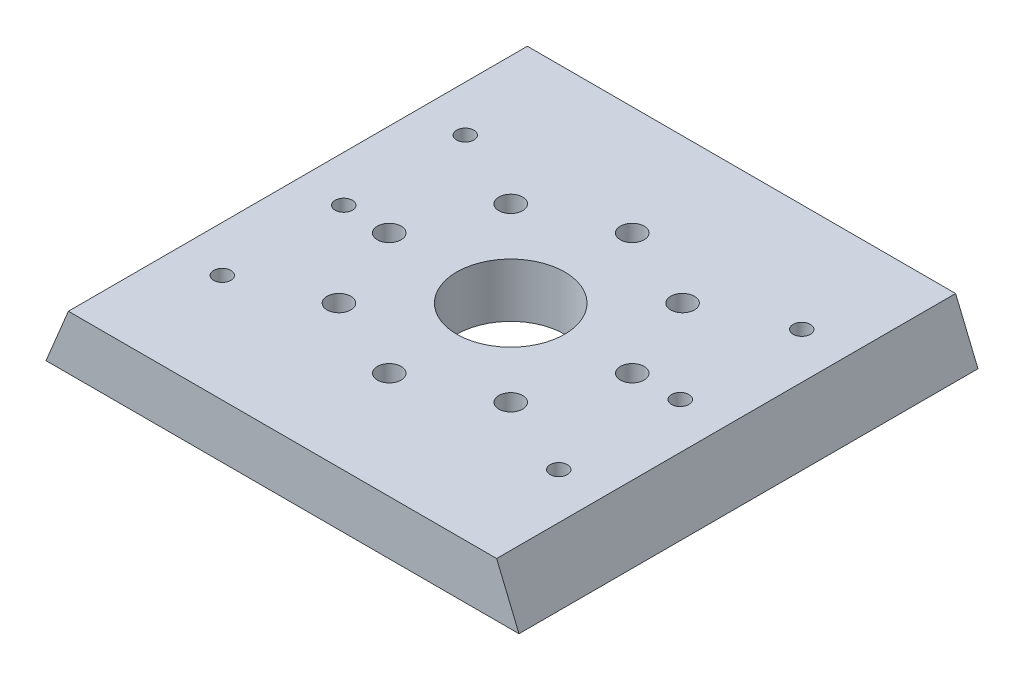
ISO-10303-21;
HEADER;
FILE_DESCRIPTION(('STEP AP214'),'2;1');
FILE_NAME('part.step','',(''),(''),'','','');
FILE_SCHEMA(('AUTOMOTIVE_DESIGN { 1 0 10303 214 1 1 1 1 }'));
ENDSEC;
DATA;
#1=APPLICATION_CONTEXT('core data for automotive mechanical design processes');
#2=APPLICATION_PROTOCOL_DEFINITION('international standard','automotive_design',2000,#1);
#3=PRODUCT_CONTEXT('',#1,'mechanical');
#4=PRODUCT('Part','Part','',(#3));
#5=PRODUCT_RELATED_PRODUCT_CATEGORY('part','',(#4));
#6=PRODUCT_DEFINITION_FORMATION('','',#4);
#7=PRODUCT_DEFINITION_CONTEXT('part definition',#1,'design');
#8=PRODUCT_DEFINITION('design','',#6,#7);
#9=PRODUCT_DEFINITION_SHAPE('','',#8);
#10=(LENGTH_UNIT() NAMED_UNIT(*) SI_UNIT(.MILLI.,.METRE.));
#11=(NAMED_UNIT(*) PLANE_ANGLE_UNIT() SI_UNIT($,.RADIAN.));
#12=(NAMED_UNIT(*) SI_UNIT($,.STERADIAN.) SOLID_ANGLE_UNIT());
#13=UNCERTAINTY_MEASURE_WITH_UNIT(LENGTH_MEASURE(1.E-05),#10,'distance_accuracy_value','');
#14=(GEOMETRIC_REPRESENTATION_CONTEXT(3) GLOBAL_UNCERTAINTY_ASSIGNED_CONTEXT((#13)) GLOBAL_UNIT_ASSIGNED_CONTEXT((#10,
#11,#12)) REPRESENTATION_CONTEXT('',''));
#15=CARTESIAN_POINT('',(0.,0.,0.));
#16=DIRECTION('',(0.,0.,1.));
#17=DIRECTION('',(1.,0.,0.));
#18=AXIS2_PLACEMENT_3D('',#15,#16,#17);
#19=CARTESIAN_POINT('',(4.14213562373091,9.99999999999999,85.));
#20=DIRECTION('',(0.923879532511288,-0.382683432365087,0.));
#21=DIRECTION('',(0.382683432365087,0.923879532511288,0.));
#22=AXIS2_PLACEMENT_3D('',#19,#20,#21);
#23=PLANE('',#22);
#24=DIRECTION('',(-0.382683432365087,-0.923879532511288,0.));
#25=VECTOR('',#24,1.);
#26=CARTESIAN_POINT('',(4.14213562373091,9.99999999999999,0.));
#27=LINE('',#26,#25);
#28=CARTESIAN_POINT('',(4.14213562373091,9.99999999999999,0.));
#29=VERTEX_POINT('',#28);
#30=CARTESIAN_POINT('',(0.,0.,0.));
#31=VERTEX_POINT('',#30);
#32=EDGE_CURVE('E112',#29,#31,#27,.T.);
#33=ORIENTED_EDGE('',*,*,#32,.T.);
#34=DIRECTION('',(0.,0.,-1.));
#35=VECTOR('',#34,1.);
#36=CARTESIAN_POINT('',(0.,0.,85.));
#37=LINE('',#36,#35);
#38=CARTESIAN_POINT('',(0.,0.,85.));
#39=VERTEX_POINT('',#38);
#40=EDGE_CURVE('E11',#39,#31,#37,.T.);
#41=ORIENTED_EDGE('',*,*,#40,.F.);
#42=DIRECTION('',(-0.382683432365087,-0.923879532511288,0.));
#43=VECTOR('',#42,1.);
#44=CARTESIAN_POINT('',(4.14213562373091,9.99999999999999,85.));
#45=LINE('',#44,#43);
#46=CARTESIAN_POINT('',(4.14213562373091,9.99999999999999,85.));
#47=VERTEX_POINT('',#46);
#48=EDGE_CURVE('E96',#47,#39,#45,.T.);
#49=ORIENTED_EDGE('',*,*,#48,.F.);
#50=DIRECTION('',(0.,0.,-1.));
#51=VECTOR('',#50,1.);
#52=CARTESIAN_POINT('',(4.14213562373091,9.99999999999999,85.));
#53=LINE('',#52,#51);
#54=EDGE_CURVE('E108',#47,#29,#53,.T.);
#55=ORIENTED_EDGE('',*,*,#54,.T.);
#56=EDGE_LOOP('',(#33,#41,#49,#55));
#57=FACE_BOUND('',#56,.T.);
#58=ADVANCED_FACE('F44',(#57),#23,.F.);
#59=CARTESIAN_POINT('',(0.,0.,85.));
#60=DIRECTION('',(0.,1.,0.));
#61=DIRECTION('',(-1.,0.,0.));
#62=AXIS2_PLACEMENT_3D('',#59,#60,#61);
#63=PLANE('',#62);
#64=CARTESIAN_POINT('',(74.9521356237309,0.,20.));
#65=DIRECTION('',(0.,1.,0.));
#66=DIRECTION('',(-1.,0.,0.));
#67=AXIS2_PLACEMENT_3D('',#64,#65,#66);
#68=CIRCLE('',#67,1.6);
#69=CARTESIAN_POINT('',(73.3521356237309,0.,20.));
#70=VERTEX_POINT('',#69);
#71=EDGE_CURVE('E194',#70,#70,#68,.T.);
#72=ORIENTED_EDGE('',*,*,#71,.T.);
#73=EDGE_LOOP('',(#72));
#74=FACE_BOUND('',#73,.T.);
#75=CARTESIAN_POINT('',(74.9521356237309,0.,42.5));
#76=DIRECTION('',(0.,1.,0.));
#77=DIRECTION('',(-1.,0.,0.));
#78=AXIS2_PLACEMENT_3D('',#75,#76,#77);
#79=CIRCLE('',#78,1.6);
#80=CARTESIAN_POINT('',(73.3521356237309,0.,42.5));
#81=VERTEX_POINT('',#80);
#82=EDGE_CURVE('E208',#81,#81,#79,.T.);
#83=ORIENTED_EDGE('',*,*,#82,.T.);
#84=EDGE_LOOP('',(#83));
#85=FACE_BOUND('',#84,.T.);
#86=CARTESIAN_POINT('',(74.9521356237309,0.,65.));
#87=DIRECTION('',(0.,1.,0.));
#88=DIRECTION('',(-1.,0.,0.));
#89=AXIS2_PLACEMENT_3D('',#86,#87,#88);
#90=CIRCLE('',#89,1.60000000000001);
#91=CARTESIAN_POINT('',(73.3521356237309,0.,65.));
#92=VERTEX_POINT('',#91);
#93=EDGE_CURVE('E212',#92,#92,#90,.T.);
#94=ORIENTED_EDGE('',*,*,#93,.T.);
#95=EDGE_LOOP('',(#94));
#96=FACE_BOUND('',#95,.T.);
#97=CARTESIAN_POINT('',(12.6421356237309,0.,65.));
#98=DIRECTION('',(0.,1.,0.));
#99=DIRECTION('',(-1.,0.,0.));
#100=AXIS2_PLACEMENT_3D('',#97,#98,#99);
#101=CIRCLE('',#100,1.6);
#102=CARTESIAN_POINT('',(11.0421356237309,0.,65.));
#103=VERTEX_POINT('',#102);
#104=EDGE_CURVE('E216',#103,#103,#101,.T.);
#105=ORIENTED_EDGE('',*,*,#104,.T.);
#106=EDGE_LOOP('',(#105));
#107=FACE_BOUND('',#106,.T.);
#108=CARTESIAN_POINT('',(12.6421356237309,0.,42.5));
#109=DIRECTION('',(0.,1.,0.));
#110=DIRECTION('',(-1.,0.,0.));
#111=AXIS2_PLACEMENT_3D('',#108,#109,#110);
#112=CIRCLE('',#111,1.6);
#113=CARTESIAN_POINT('',(11.0421356237309,0.,42.5));
#114=VERTEX_POINT('',#113);
#115=EDGE_CURVE('E220',#114,#114,#112,.T.);
#116=ORIENTED_EDGE('',*,*,#115,.T.);
#117=EDGE_LOOP('',(#116));
#118=FACE_BOUND('',#117,.T.);
#119=CARTESIAN_POINT('',(12.6421356237309,0.,20.));
#120=DIRECTION('',(0.,1.,0.));
#121=DIRECTION('',(-1.,0.,0.));
#122=AXIS2_PLACEMENT_3D('',#119,#120,#121);
#123=CIRCLE('',#122,1.6);
#124=CARTESIAN_POINT('',(11.0421356237309,0.,20.));
#125=VERTEX_POINT('',#124);
#126=EDGE_CURVE('E224',#125,#125,#123,.T.);
#127=ORIENTED_EDGE('',*,*,#126,.T.);
#128=EDGE_LOOP('',(#127));
#129=FACE_BOUND('',#128,.T.);
#130=CARTESIAN_POINT('',(43.7971356237303,0.,20.2349696188111));
#131=DIRECTION('',(0.,1.,0.));
#132=DIRECTION('',(-1.,0.,0.));
#133=AXIS2_PLACEMENT_3D('',#130,#131,#132);
#134=CIRCLE('',#133,2.2);
#135=CARTESIAN_POINT('',(41.5971356237303,0.,20.2349696188111));
#136=VERTEX_POINT('',#135);
#137=EDGE_CURVE('E116',#136,#136,#134,.T.);
#138=ORIENTED_EDGE('',*,*,#137,.T.);
#139=EDGE_LOOP('',(#138));
#140=FACE_BOUND('',#139,.T.);
#141=CARTESIAN_POINT('',(59.7070382004277,0.,26.8250670421138));
#142=DIRECTION('',(0.,1.,0.));
#143=DIRECTION('',(-1.,0.,0.));
#144=AXIS2_PLACEMENT_3D('',#141,#142,#143);
#145=CIRCLE('',#144,2.2);
#146=CARTESIAN_POINT('',(57.5070382004277,0.,26.8250670421138));
#147=VERTEX_POINT('',#146);
#148=EDGE_CURVE('E136',#147,#147,#145,.T.);
#149=ORIENTED_EDGE('',*,*,#148,.T.);
#150=EDGE_LOOP('',(#149));
#151=FACE_BOUND('',#150,.T.);
#152=CARTESIAN_POINT('',(66.2971356237313,0.,42.7349696188101));
#153=DIRECTION('',(0.,1.,0.));
#154=DIRECTION('',(-1.,0.,0.));
#155=AXIS2_PLACEMENT_3D('',#152,#153,#154);
#156=CIRCLE('',#155,2.20000000000071);
#157=CARTESIAN_POINT('',(64.0971356237306,0.,42.7349696188101));
#158=VERTEX_POINT('',#157);
#159=EDGE_CURVE('E140',#158,#158,#156,.T.);
#160=ORIENTED_EDGE('',*,*,#159,.T.);
#161=EDGE_LOOP('',(#160));
#162=FACE_BOUND('',#161,.T.);
#163=CARTESIAN_POINT('',(59.7070382004293,0.,58.6448721955077));
#164=DIRECTION('',(0.,1.,0.));
#165=DIRECTION('',(-1.,0.,0.));
#166=AXIS2_PLACEMENT_3D('',#163,#164,#165);
#167=CIRCLE('',#166,2.20000000000147);
#168=CARTESIAN_POINT('',(57.5070382004278,0.,58.6448721955077));
#169=VERTEX_POINT('',#168);
#170=EDGE_CURVE('E144',#169,#169,#167,.T.);
#171=ORIENTED_EDGE('',*,*,#170,.T.);
#172=EDGE_LOOP('',(#171));
#173=FACE_BOUND('',#172,.T.);
#174=CARTESIAN_POINT('',(43.7971356237322,0.,65.2349696188111));
#175=DIRECTION('',(0.,1.,0.));
#176=DIRECTION('',(-1.,0.,0.));
#177=AXIS2_PLACEMENT_3D('',#174,#175,#176);
#178=CIRCLE('',#177,2.20000000000198);
#179=CARTESIAN_POINT('',(41.5971356237302,0.,65.2349696188111));
#180=VERTEX_POINT('',#179);
#181=EDGE_CURVE('E148',#180,#180,#178,.T.);
#182=ORIENTED_EDGE('',*,*,#181,.T.);
#183=EDGE_LOOP('',(#182));
#184=FACE_BOUND('',#183,.T.);
#185=CARTESIAN_POINT('',(27.8872330470346,0.,58.6448721955091));
#186=DIRECTION('',(0.,1.,0.));
#187=DIRECTION('',(-1.,0.,0.));
#188=AXIS2_PLACEMENT_3D('',#185,#186,#187);
#189=CIRCLE('',#188,2.20000000000194);
#190=CARTESIAN_POINT('',(25.6872330470327,0.,58.6448721955091));
#191=VERTEX_POINT('',#190);
#192=EDGE_CURVE('E152',#191,#191,#189,.T.);
#193=ORIENTED_EDGE('',*,*,#192,.T.);
#194=EDGE_LOOP('',(#193));
#195=FACE_BOUND('',#194,.T.);
#196=CARTESIAN_POINT('',(21.2971356237313,0.,42.734969618812));
#197=DIRECTION('',(0.,1.,0.));
#198=DIRECTION('',(-1.,0.,0.));
#199=AXIS2_PLACEMENT_3D('',#196,#197,#198);
#200=CIRCLE('',#199,2.20000000000142);
#201=CARTESIAN_POINT('',(19.0971356237299,0.,42.734969618812));
#202=VERTEX_POINT('',#201);
#203=EDGE_CURVE('E156',#202,#202,#200,.T.);
#204=ORIENTED_EDGE('',*,*,#203,.T.);
#205=EDGE_LOOP('',(#204));
#206=FACE_BOUND('',#205,.T.);
#207=CARTESIAN_POINT('',(27.8872330470333,0.,26.8250670421144));
#208=DIRECTION('',(0.,1.,0.));
#209=DIRECTION('',(-1.,0.,0.));
#210=AXIS2_PLACEMENT_3D('',#207,#208,#209);
#211=CIRCLE('',#210,2.20000000000073);
#212=CARTESIAN_POINT('',(25.6872330470326,0.,26.8250670421144));
#213=VERTEX_POINT('',#212);
#214=EDGE_CURVE('E160',#213,#213,#211,.T.);
#215=ORIENTED_EDGE('',*,*,#214,.T.);
#216=EDGE_LOOP('',(#215));
#217=FACE_BOUND('',#216,.T.);
#218=CARTESIAN_POINT('',(43.7971356237303,0.,42.7349696188111));
#219=DIRECTION('',(0.,1.,0.));
#220=DIRECTION('',(-1.,0.,0.));
#221=AXIS2_PLACEMENT_3D('',#218,#219,#220);
#222=CIRCLE('',#221,10.);
#223=CARTESIAN_POINT('',(33.7971356237303,0.,42.7349696188111));
#224=VERTEX_POINT('',#223);
#225=EDGE_CURVE('E164',#224,#224,#222,.T.);
#226=ORIENTED_EDGE('',*,*,#225,.T.);
#227=EDGE_LOOP('',(#226));
#228=FACE_BOUND('',#227,.T.);
#229=DIRECTION('',(1.,0.,0.));
#230=VECTOR('',#229,1.);
#231=CARTESIAN_POINT('',(0.,0.,0.));
#232=LINE('',#231,#230);
#233=CARTESIAN_POINT('',(87.5942712474618,0.,0.));
#234=VERTEX_POINT('',#233);
#235=EDGE_CURVE('E101',#31,#234,#232,.T.);
#236=ORIENTED_EDGE('',*,*,#235,.T.);
#237=DIRECTION('',(0.,0.,-1.));
#238=VECTOR('',#237,1.);
#239=CARTESIAN_POINT('',(87.5942712474618,0.,85.));
#240=LINE('',#239,#238);
#241=CARTESIAN_POINT('',(87.5942712474618,0.,85.));
#242=VERTEX_POINT('',#241);
#243=EDGE_CURVE('E53',#242,#234,#240,.T.);
#244=ORIENTED_EDGE('',*,*,#243,.F.);
#245=DIRECTION('',(1.,0.,0.));
#246=VECTOR('',#245,1.);
#247=CARTESIAN_POINT('',(0.,0.,85.));
#248=LINE('',#247,#246);
#249=EDGE_CURVE('E91',#39,#242,#248,.T.);
#250=ORIENTED_EDGE('',*,*,#249,.F.);
#251=ORIENTED_EDGE('',*,*,#40,.T.);
#252=EDGE_LOOP('',(#236,#244,#250,#251));
#253=FACE_BOUND('',#252,.T.);
#254=ADVANCED_FACE('F100',(#74,#85,#96,#107,#118,#129,#140,#151,#162,#173,#184,#195,#206,#217,
#228,#253),#63,.F.);
#255=CARTESIAN_POINT('',(87.5942712474618,0.,85.));
#256=DIRECTION('',(-0.923879532511288,-0.382683432365087,0.));
#257=DIRECTION('',(0.382683432365087,-0.923879532511288,0.));
#258=AXIS2_PLACEMENT_3D('',#255,#256,#257);
#259=PLANE('',#258);
#260=DIRECTION('',(-0.382683432365087,0.923879532511288,0.));
#261=VECTOR('',#260,1.);
#262=CARTESIAN_POINT('',(87.5942712474618,0.,0.));
#263=LINE('',#262,#261);
#264=CARTESIAN_POINT('',(83.4521356237309,10.,0.));
#265=VERTEX_POINT('',#264);
#266=EDGE_CURVE('E78',#234,#265,#263,.T.);
#267=ORIENTED_EDGE('',*,*,#266,.T.);
#268=DIRECTION('',(0.,0.,-1.));
#269=VECTOR('',#268,1.);
#270=CARTESIAN_POINT('',(83.4521356237309,10.,85.));
#271=LINE('',#270,#269);
#272=CARTESIAN_POINT('',(83.4521356237309,10.,85.));
#273=VERTEX_POINT('',#272);
#274=EDGE_CURVE('E103',#273,#265,#271,.T.);
#275=ORIENTED_EDGE('',*,*,#274,.F.);
#276=DIRECTION('',(-0.382683432365087,0.923879532511288,0.));
#277=VECTOR('',#276,1.);
#278=CARTESIAN_POINT('',(87.5942712474618,0.,85.));
#279=LINE('',#278,#277);
#280=EDGE_CURVE('E94',#242,#273,#279,.T.);
#281=ORIENTED_EDGE('',*,*,#280,.F.);
#282=ORIENTED_EDGE('',*,*,#243,.T.);
#283=EDGE_LOOP('',(#267,#275,#281,#282));
#284=FACE_BOUND('',#283,.T.);
#285=ADVANCED_FACE('F104',(#284),#259,.F.);
#286=CARTESIAN_POINT('',(83.4521356237309,10.,85.));
#287=DIRECTION('',(0.,-1.,0.));
#288=DIRECTION('',(1.,0.,0.));
#289=AXIS2_PLACEMENT_3D('',#286,#287,#288);
#290=PLANE('',#289);
#291=CARTESIAN_POINT('',(74.9521356237309,10.,20.));
#292=DIRECTION('',(0.,1.,0.));
#293=DIRECTION('',(1.,0.,0.));
#294=AXIS2_PLACEMENT_3D('',#291,#292,#293);
#295=CIRCLE('',#294,1.6);
#296=CARTESIAN_POINT('',(76.5521356237309,10.,20.));
#297=VERTEX_POINT('',#296);
#298=EDGE_CURVE('E233',#297,#297,#295,.T.);
#299=ORIENTED_EDGE('',*,*,#298,.F.);
#300=EDGE_LOOP('',(#299));
#301=FACE_BOUND('',#300,.T.);
#302=CARTESIAN_POINT('',(74.9521356237309,10.,42.5));
#303=DIRECTION('',(0.,1.,0.));
#304=DIRECTION('',(1.,0.,0.));
#305=AXIS2_PLACEMENT_3D('',#302,#303,#304);
#306=CIRCLE('',#305,1.6);
#307=CARTESIAN_POINT('',(76.5521356237309,10.,42.5));
#308=VERTEX_POINT('',#307);
#309=EDGE_CURVE('E237',#308,#308,#306,.T.);
#310=ORIENTED_EDGE('',*,*,#309,.F.);
#311=EDGE_LOOP('',(#310));
#312=FACE_BOUND('',#311,.T.);
#313=CARTESIAN_POINT('',(74.9521356237309,10.,65.));
#314=DIRECTION('',(0.,1.,0.));
#315=DIRECTION('',(-1.,0.,0.));
#316=AXIS2_PLACEMENT_3D('',#313,#314,#315);
#317=CIRCLE('',#316,1.60000000000001);
#318=CARTESIAN_POINT('',(73.3521356237309,10.,65.));
#319=VERTEX_POINT('',#318);
#320=EDGE_CURVE('E241',#319,#319,#317,.T.);
#321=ORIENTED_EDGE('',*,*,#320,.F.);
#322=EDGE_LOOP('',(#321));
#323=FACE_BOUND('',#322,.T.);
#324=CARTESIAN_POINT('',(12.6421356237309,9.99999999999999,65.));
#325=DIRECTION('',(0.,1.,0.));
#326=DIRECTION('',(1.,0.,0.));
#327=AXIS2_PLACEMENT_3D('',#324,#325,#326);
#328=CIRCLE('',#327,1.6);
#329=CARTESIAN_POINT('',(14.2421356237309,9.99999999999999,65.));
#330=VERTEX_POINT('',#329);
#331=EDGE_CURVE('E245',#330,#330,#328,.T.);
#332=ORIENTED_EDGE('',*,*,#331,.F.);
#333=EDGE_LOOP('',(#332));
#334=FACE_BOUND('',#333,.T.);
#335=CARTESIAN_POINT('',(12.6421356237309,9.99999999999999,42.5));
#336=DIRECTION('',(0.,1.,0.));
#337=DIRECTION('',(-1.,0.,0.));
#338=AXIS2_PLACEMENT_3D('',#335,#336,#337);
#339=CIRCLE('',#338,1.6);
#340=CARTESIAN_POINT('',(11.0421356237309,9.99999999999999,42.5));
#341=VERTEX_POINT('',#340);
#342=EDGE_CURVE('E232',#341,#341,#339,.T.);
#343=ORIENTED_EDGE('',*,*,#342,.F.);
#344=EDGE_LOOP('',(#343));
#345=FACE_BOUND('',#344,.T.);
#346=CARTESIAN_POINT('',(12.6421356237309,9.99999999999999,20.));
#347=DIRECTION('',(0.,1.,0.));
#348=DIRECTION('',(-1.,0.,0.));
#349=AXIS2_PLACEMENT_3D('',#346,#347,#348);
#350=CIRCLE('',#349,1.6);
#351=CARTESIAN_POINT('',(11.0421356237309,9.99999999999999,20.));
#352=VERTEX_POINT('',#351);
#353=EDGE_CURVE('E228',#352,#352,#350,.T.);
#354=ORIENTED_EDGE('',*,*,#353,.F.);
#355=EDGE_LOOP('',(#354));
#356=FACE_BOUND('',#355,.T.);
#357=CARTESIAN_POINT('',(43.7971356237303,10.,20.2349696188111));
#358=DIRECTION('',(0.,1.,0.));
#359=DIRECTION('',(-1.,0.,0.));
#360=AXIS2_PLACEMENT_3D('',#357,#358,#359);
#361=CIRCLE('',#360,2.2);
#362=CARTESIAN_POINT('',(41.5971356237303,10.,20.2349696188111));
#363=VERTEX_POINT('',#362);
#364=EDGE_CURVE('E172',#363,#363,#361,.T.);
#365=ORIENTED_EDGE('',*,*,#364,.F.);
#366=EDGE_LOOP('',(#365));
#367=FACE_BOUND('',#366,.T.);
#368=CARTESIAN_POINT('',(59.7070382004277,10.,26.8250670421138));
#369=DIRECTION('',(0.,1.,0.));
#370=DIRECTION('',(-1.,0.,0.));
#371=AXIS2_PLACEMENT_3D('',#368,#369,#370);
#372=CIRCLE('',#371,2.2);
#373=CARTESIAN_POINT('',(57.5070382004277,10.,26.8250670421138));
#374=VERTEX_POINT('',#373);
#375=EDGE_CURVE('E182',#374,#374,#372,.T.);
#376=ORIENTED_EDGE('',*,*,#375,.F.);
#377=EDGE_LOOP('',(#376));
#378=FACE_BOUND('',#377,.T.);
#379=CARTESIAN_POINT('',(66.2971356237313,10.,42.7349696188101));
#380=DIRECTION('',(0.,1.,0.));
#381=DIRECTION('',(-1.,0.,0.));
#382=AXIS2_PLACEMENT_3D('',#379,#380,#381);
#383=CIRCLE('',#382,2.20000000000071);
#384=CARTESIAN_POINT('',(64.0971356237306,10.,42.7349696188101));
#385=VERTEX_POINT('',#384);
#386=EDGE_CURVE('E177',#385,#385,#383,.T.);
#387=ORIENTED_EDGE('',*,*,#386,.F.);
#388=EDGE_LOOP('',(#387));
#389=FACE_BOUND('',#388,.T.);
#390=CARTESIAN_POINT('',(59.7070382004293,10.,58.6448721955077));
#391=DIRECTION('',(0.,1.,0.));
#392=DIRECTION('',(-1.,0.,0.));
#393=AXIS2_PLACEMENT_3D('',#390,#391,#392);
#394=CIRCLE('',#393,2.20000000000147);
#395=CARTESIAN_POINT('',(57.5070382004278,10.,58.6448721955077));
#396=VERTEX_POINT('',#395);
#397=EDGE_CURVE('E173',#396,#396,#394,.T.);
#398=ORIENTED_EDGE('',*,*,#397,.F.);
#399=EDGE_LOOP('',(#398));
#400=FACE_BOUND('',#399,.T.);
#401=CARTESIAN_POINT('',(43.7971356237322,10.,65.2349696188111));
#402=DIRECTION('',(0.,1.,0.));
#403=DIRECTION('',(-1.,0.,0.));
#404=AXIS2_PLACEMENT_3D('',#401,#402,#403);
#405=CIRCLE('',#404,2.20000000000198);
#406=CARTESIAN_POINT('',(41.5971356237302,10.,65.2349696188111));
#407=VERTEX_POINT('',#406);
#408=EDGE_CURVE('E178',#407,#407,#405,.T.);
#409=ORIENTED_EDGE('',*,*,#408,.F.);
#410=EDGE_LOOP('',(#409));
#411=FACE_BOUND('',#410,.T.);
#412=CARTESIAN_POINT('',(27.8872330470346,9.99999999999999,58.6448721955091));
#413=DIRECTION('',(0.,1.,0.));
#414=DIRECTION('',(-1.,0.,0.));
#415=AXIS2_PLACEMENT_3D('',#412,#413,#414);
#416=CIRCLE('',#415,2.20000000000194);
#417=CARTESIAN_POINT('',(25.6872330470327,9.99999999999999,58.6448721955091));
#418=VERTEX_POINT('',#417);
#419=EDGE_CURVE('E198',#418,#418,#416,.T.);
#420=ORIENTED_EDGE('',*,*,#419,.F.);
#421=EDGE_LOOP('',(#420));
#422=FACE_BOUND('',#421,.T.);
#423=CARTESIAN_POINT('',(21.2971356237313,9.99999999999999,42.734969618812));
#424=DIRECTION('',(0.,1.,0.));
#425=DIRECTION('',(-1.,0.,0.));
#426=AXIS2_PLACEMENT_3D('',#423,#424,#425);
#427=CIRCLE('',#426,2.20000000000142);
#428=CARTESIAN_POINT('',(19.0971356237299,9.99999999999999,42.734969618812));
#429=VERTEX_POINT('',#428);
#430=EDGE_CURVE('E193',#429,#429,#427,.T.);
#431=ORIENTED_EDGE('',*,*,#430,.F.);
#432=EDGE_LOOP('',(#431));
#433=FACE_BOUND('',#432,.T.);
#434=CARTESIAN_POINT('',(27.8872330470333,9.99999999999999,26.8250670421144));
#435=DIRECTION('',(0.,1.,0.));
#436=DIRECTION('',(-1.,0.,0.));
#437=AXIS2_PLACEMENT_3D('',#434,#435,#436);
#438=CIRCLE('',#437,2.20000000000073);
#439=CARTESIAN_POINT('',(25.6872330470325,9.99999999999999,26.8250670421144));
#440=VERTEX_POINT('',#439);
#441=EDGE_CURVE('E189',#440,#440,#438,.T.);
#442=ORIENTED_EDGE('',*,*,#441,.F.);
#443=EDGE_LOOP('',(#442));
#444=FACE_BOUND('',#443,.T.);
#445=CARTESIAN_POINT('',(43.7971356237303,10.,42.7349696188111));
#446=DIRECTION('',(0.,1.,0.));
#447=DIRECTION('',(-1.,0.,0.));
#448=AXIS2_PLACEMENT_3D('',#445,#446,#447);
#449=CIRCLE('',#448,10.);
#450=CARTESIAN_POINT('',(33.7971356237303,9.99999999999999,42.7349696188111));
#451=VERTEX_POINT('',#450);
#452=EDGE_CURVE('E168',#451,#451,#449,.T.);
#453=ORIENTED_EDGE('',*,*,#452,.F.);
#454=EDGE_LOOP('',(#453));
#455=FACE_BOUND('',#454,.T.);
#456=DIRECTION('',(-1.,0.,0.));
#457=VECTOR('',#456,1.);
#458=CARTESIAN_POINT('',(83.4521356237309,10.,0.));
#459=LINE('',#458,#457);
#460=EDGE_CURVE('E84',#265,#29,#459,.T.);
#461=ORIENTED_EDGE('',*,*,#460,.T.);
#462=ORIENTED_EDGE('',*,*,#54,.F.);
#463=DIRECTION('',(-1.,0.,0.));
#464=VECTOR('',#463,1.);
#465=CARTESIAN_POINT('',(83.4521356237309,10.,85.));
#466=LINE('',#465,#464);
#467=EDGE_CURVE('E61',#273,#47,#466,.T.);
#468=ORIENTED_EDGE('',*,*,#467,.F.);
#469=ORIENTED_EDGE('',*,*,#274,.T.);
#470=EDGE_LOOP('',(#461,#462,#468,#469));
#471=FACE_BOUND('',#470,.T.);
#472=ADVANCED_FACE('F126',(#301,#312,#323,#334,#345,#356,#367,#378,#389,#400,#411,#422,#433,
#444,#455,#471),#290,.F.);
#473=CARTESIAN_POINT('',(0.,0.,85.));
#474=DIRECTION('',(0.,0.,1.));
#475=DIRECTION('',(1.,0.,0.));
#476=AXIS2_PLACEMENT_3D('',#473,#474,#475);
#477=PLANE('',#476);
#478=ORIENTED_EDGE('',*,*,#48,.T.);
#479=ORIENTED_EDGE('',*,*,#249,.T.);
#480=ORIENTED_EDGE('',*,*,#280,.T.);
#481=ORIENTED_EDGE('',*,*,#467,.T.);
#482=EDGE_LOOP('',(#478,#479,#480,#481));
#483=FACE_BOUND('',#482,.T.);
#484=ADVANCED_FACE('F92',(#483),#477,.T.);
#485=CARTESIAN_POINT('',(0.,0.,0.));
#486=DIRECTION('',(0.,0.,1.));
#487=DIRECTION('',(1.,0.,0.));
#488=AXIS2_PLACEMENT_3D('',#485,#486,#487);
#489=PLANE('',#488);
#490=ORIENTED_EDGE('',*,*,#32,.F.);
#491=ORIENTED_EDGE('',*,*,#460,.F.);
#492=ORIENTED_EDGE('',*,*,#266,.F.);
#493=ORIENTED_EDGE('',*,*,#235,.F.);
#494=EDGE_LOOP('',(#490,#491,#492,#493));
#495=FACE_BOUND('',#494,.T.);
#496=ADVANCED_FACE('F129',(#495),#489,.F.);
#497=CARTESIAN_POINT('',(43.7971356237303,-75.,42.7349696188111));
#498=DIRECTION('',(0.,1.,0.));
#499=DIRECTION('',(-1.,0.,0.));
#500=AXIS2_PLACEMENT_3D('',#497,#498,#499);
#501=CYLINDRICAL_SURFACE('',#500,10.);
#502=ORIENTED_EDGE('',*,*,#452,.T.);
#503=EDGE_LOOP('',(#502));
#504=FACE_BOUND('',#503,.T.);
#505=ORIENTED_EDGE('',*,*,#225,.F.);
#506=EDGE_LOOP('',(#505));
#507=FACE_BOUND('',#506,.T.);
#508=ADVANCED_FACE('F280',(#504,#507),#501,.F.);
#509=CARTESIAN_POINT('',(27.8872330470333,-75.,26.8250670421144));
#510=DIRECTION('',(0.,1.,0.));
#511=DIRECTION('',(-1.,0.,0.));
#512=AXIS2_PLACEMENT_3D('',#509,#510,#511);
#513=CYLINDRICAL_SURFACE('',#512,2.20000000000073);
#514=ORIENTED_EDGE('',*,*,#441,.T.);
#515=EDGE_LOOP('',(#514));
#516=FACE_BOUND('',#515,.T.);
#517=ORIENTED_EDGE('',*,*,#214,.F.);
#518=EDGE_LOOP('',(#517));
#519=FACE_BOUND('',#518,.T.);
#520=ADVANCED_FACE('F283',(#516,#519),#513,.F.);
#521=CARTESIAN_POINT('',(21.2971356237313,-75.,42.734969618812));
#522=DIRECTION('',(0.,1.,0.));
#523=DIRECTION('',(-1.,0.,0.));
#524=AXIS2_PLACEMENT_3D('',#521,#522,#523);
#525=CYLINDRICAL_SURFACE('',#524,2.20000000000142);
#526=ORIENTED_EDGE('',*,*,#430,.T.);
#527=EDGE_LOOP('',(#526));
#528=FACE_BOUND('',#527,.T.);
#529=ORIENTED_EDGE('',*,*,#203,.F.);
#530=EDGE_LOOP('',(#529));
#531=FACE_BOUND('',#530,.T.);
#532=ADVANCED_FACE('F320',(#528,#531),#525,.F.);
#533=CARTESIAN_POINT('',(27.8872330470346,-75.,58.6448721955091));
#534=DIRECTION('',(0.,1.,0.));
#535=DIRECTION('',(-1.,0.,0.));
#536=AXIS2_PLACEMENT_3D('',#533,#534,#535);
#537=CYLINDRICAL_SURFACE('',#536,2.20000000000194);
#538=ORIENTED_EDGE('',*,*,#419,.T.);
#539=EDGE_LOOP('',(#538));
#540=FACE_BOUND('',#539,.T.);
#541=ORIENTED_EDGE('',*,*,#192,.F.);
#542=EDGE_LOOP('',(#541));
#543=FACE_BOUND('',#542,.T.);
#544=ADVANCED_FACE('F324',(#540,#543),#537,.F.);
#545=CARTESIAN_POINT('',(43.7971356237322,-75.,65.2349696188111));
#546=DIRECTION('',(0.,1.,0.));
#547=DIRECTION('',(-1.,0.,0.));
#548=AXIS2_PLACEMENT_3D('',#545,#546,#547);
#549=CYLINDRICAL_SURFACE('',#548,2.20000000000198);
#550=ORIENTED_EDGE('',*,*,#408,.T.);
#551=EDGE_LOOP('',(#550));
#552=FACE_BOUND('',#551,.T.);
#553=ORIENTED_EDGE('',*,*,#181,.F.);
#554=EDGE_LOOP('',(#553));
#555=FACE_BOUND('',#554,.T.);
#556=ADVANCED_FACE('F305',(#552,#555),#549,.F.);
#557=CARTESIAN_POINT('',(59.7070382004293,-75.,58.6448721955077));
#558=DIRECTION('',(0.,1.,0.));
#559=DIRECTION('',(-1.,0.,0.));
#560=AXIS2_PLACEMENT_3D('',#557,#558,#559);
#561=CYLINDRICAL_SURFACE('',#560,2.20000000000147);
#562=ORIENTED_EDGE('',*,*,#397,.T.);
#563=EDGE_LOOP('',(#562));
#564=FACE_BOUND('',#563,.T.);
#565=ORIENTED_EDGE('',*,*,#170,.F.);
#566=EDGE_LOOP('',(#565));
#567=FACE_BOUND('',#566,.T.);
#568=ADVANCED_FACE('F301',(#564,#567),#561,.F.);
#569=CARTESIAN_POINT('',(66.2971356237313,-75.,42.7349696188101));
#570=DIRECTION('',(0.,1.,0.));
#571=DIRECTION('',(-1.,0.,0.));
#572=AXIS2_PLACEMENT_3D('',#569,#570,#571);
#573=CYLINDRICAL_SURFACE('',#572,2.20000000000071);
#574=ORIENTED_EDGE('',*,*,#386,.T.);
#575=EDGE_LOOP('',(#574));
#576=FACE_BOUND('',#575,.T.);
#577=ORIENTED_EDGE('',*,*,#159,.F.);
#578=EDGE_LOOP('',(#577));
#579=FACE_BOUND('',#578,.T.);
#580=ADVANCED_FACE('F304',(#576,#579),#573,.F.);
#581=CARTESIAN_POINT('',(59.7070382004277,-75.,26.8250670421138));
#582=DIRECTION('',(0.,1.,0.));
#583=DIRECTION('',(-1.,0.,0.));
#584=AXIS2_PLACEMENT_3D('',#581,#582,#583);
#585=CYLINDRICAL_SURFACE('',#584,2.2);
#586=ORIENTED_EDGE('',*,*,#375,.T.);
#587=EDGE_LOOP('',(#586));
#588=FACE_BOUND('',#587,.T.);
#589=ORIENTED_EDGE('',*,*,#148,.F.);
#590=EDGE_LOOP('',(#589));
#591=FACE_BOUND('',#590,.T.);
#592=ADVANCED_FACE('F309',(#588,#591),#585,.F.);
#593=CARTESIAN_POINT('',(43.7971356237303,-75.,20.2349696188111));
#594=DIRECTION('',(0.,1.,0.));
#595=DIRECTION('',(-1.,0.,0.));
#596=AXIS2_PLACEMENT_3D('',#593,#594,#595);
#597=CYLINDRICAL_SURFACE('',#596,2.2);
#598=ORIENTED_EDGE('',*,*,#364,.T.);
#599=EDGE_LOOP('',(#598));
#600=FACE_BOUND('',#599,.T.);
#601=ORIENTED_EDGE('',*,*,#137,.F.);
#602=EDGE_LOOP('',(#601));
#603=FACE_BOUND('',#602,.T.);
#604=ADVANCED_FACE('F313',(#600,#603),#597,.F.);
#605=CARTESIAN_POINT('',(12.6421356237309,-75.,20.));
#606=DIRECTION('',(0.,1.,0.));
#607=DIRECTION('',(-1.,0.,0.));
#608=AXIS2_PLACEMENT_3D('',#605,#606,#607);
#609=CYLINDRICAL_SURFACE('',#608,1.6);
#610=ORIENTED_EDGE('',*,*,#353,.T.);
#611=EDGE_LOOP('',(#610));
#612=FACE_BOUND('',#611,.T.);
#613=ORIENTED_EDGE('',*,*,#126,.F.);
#614=EDGE_LOOP('',(#613));
#615=FACE_BOUND('',#614,.T.);
#616=ADVANCED_FACE('F316',(#612,#615),#609,.F.);
#617=CARTESIAN_POINT('',(12.6421356237309,-75.,42.5));
#618=DIRECTION('',(0.,1.,0.));
#619=DIRECTION('',(-1.,0.,0.));
#620=AXIS2_PLACEMENT_3D('',#617,#618,#619);
#621=CYLINDRICAL_SURFACE('',#620,1.6);
#622=ORIENTED_EDGE('',*,*,#342,.T.);
#623=EDGE_LOOP('',(#622));
#624=FACE_BOUND('',#623,.T.);
#625=ORIENTED_EDGE('',*,*,#115,.F.);
#626=EDGE_LOOP('',(#625));
#627=FACE_BOUND('',#626,.T.);
#628=ADVANCED_FACE('F253',(#624,#627),#621,.F.);
#629=CARTESIAN_POINT('',(12.6421356237309,-75.,65.));
#630=DIRECTION('',(0.,1.,0.));
#631=DIRECTION('',(-1.,0.,0.));
#632=AXIS2_PLACEMENT_3D('',#629,#630,#631);
#633=CYLINDRICAL_SURFACE('',#632,1.6);
#634=ORIENTED_EDGE('',*,*,#331,.T.);
#635=EDGE_LOOP('',(#634));
#636=FACE_BOUND('',#635,.T.);
#637=ORIENTED_EDGE('',*,*,#104,.F.);
#638=EDGE_LOOP('',(#637));
#639=FACE_BOUND('',#638,.T.);
#640=ADVANCED_FACE('F346',(#636,#639),#633,.F.);
#641=CARTESIAN_POINT('',(74.9521356237309,-75.,65.));
#642=DIRECTION('',(0.,1.,0.));
#643=DIRECTION('',(-1.,0.,0.));
#644=AXIS2_PLACEMENT_3D('',#641,#642,#643);
#645=CYLINDRICAL_SURFACE('',#644,1.60000000000001);
#646=ORIENTED_EDGE('',*,*,#320,.T.);
#647=EDGE_LOOP('',(#646));
#648=FACE_BOUND('',#647,.T.);
#649=ORIENTED_EDGE('',*,*,#93,.F.);
#650=EDGE_LOOP('',(#649));
#651=FACE_BOUND('',#650,.T.);
#652=ADVANCED_FACE('F342',(#648,#651),#645,.F.);
#653=CARTESIAN_POINT('',(74.9521356237309,-75.,42.5));
#654=DIRECTION('',(0.,1.,0.));
#655=DIRECTION('',(-1.,0.,0.));
#656=AXIS2_PLACEMENT_3D('',#653,#654,#655);
#657=CYLINDRICAL_SURFACE('',#656,1.6);
#658=ORIENTED_EDGE('',*,*,#309,.T.);
#659=EDGE_LOOP('',(#658));
#660=FACE_BOUND('',#659,.T.);
#661=ORIENTED_EDGE('',*,*,#82,.F.);
#662=EDGE_LOOP('',(#661));
#663=FACE_BOUND('',#662,.T.);
#664=ADVANCED_FACE('F338',(#660,#663),#657,.F.);
#665=CARTESIAN_POINT('',(74.9521356237309,-75.,20.));
#666=DIRECTION('',(0.,1.,0.));
#667=DIRECTION('',(-1.,0.,0.));
#668=AXIS2_PLACEMENT_3D('',#665,#666,#667);
#669=CYLINDRICAL_SURFACE('',#668,1.6);
#670=ORIENTED_EDGE('',*,*,#298,.T.);
#671=EDGE_LOOP('',(#670));
#672=FACE_BOUND('',#671,.T.);
#673=ORIENTED_EDGE('',*,*,#71,.F.);
#674=EDGE_LOOP('',(#673));
#675=FACE_BOUND('',#674,.T.);
#676=ADVANCED_FACE('F335',(#672,#675),#669,.F.);
#677=CLOSED_SHELL('',(#58,#254,#285,#472,#484,#496,#508,#520,#532,#544,#556,#568,#580,#592,#604,
#616,#628,#640,#652,#664,#676));
#678=MANIFOLD_SOLID_BREP('B2',#677);
#679=ADVANCED_BREP_SHAPE_REPRESENTATION('',(#18,#678),#14);
#680=SHAPE_DEFINITION_REPRESENTATION(#9,#679);
ENDSEC;
END-ISO-10303-21;
